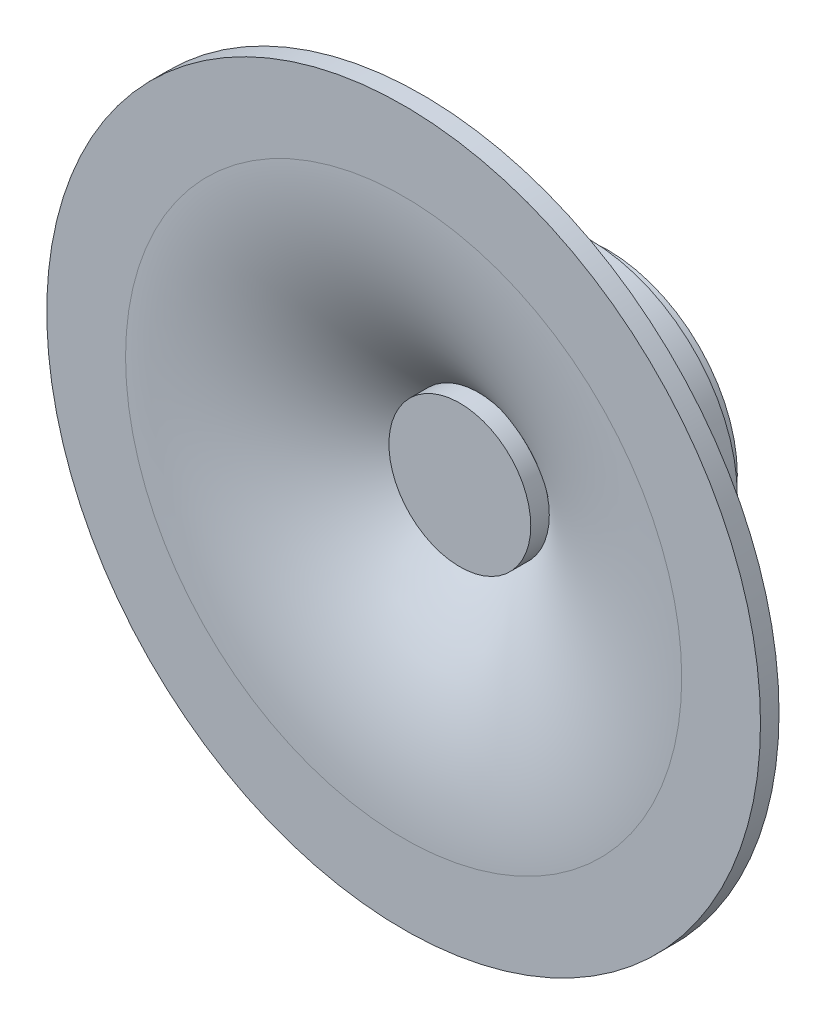
ISO-10303-21;
HEADER;
FILE_DESCRIPTION(('STEP AP214'),'2;1');
FILE_NAME('part.step','',(''),(''),'','','');
FILE_SCHEMA(('AUTOMOTIVE_DESIGN { 1 0 10303 214 1 1 1 1 }'));
ENDSEC;
DATA;
#1=APPLICATION_CONTEXT('core data for automotive mechanical design processes');
#2=APPLICATION_PROTOCOL_DEFINITION('international standard','automotive_design',2000,#1);
#3=PRODUCT_CONTEXT('',#1,'mechanical');
#4=PRODUCT('Part','Part','',(#3));
#5=PRODUCT_RELATED_PRODUCT_CATEGORY('part','',(#4));
#6=PRODUCT_DEFINITION_FORMATION('','',#4);
#7=PRODUCT_DEFINITION_CONTEXT('part definition',#1,'design');
#8=PRODUCT_DEFINITION('design','',#6,#7);
#9=PRODUCT_DEFINITION_SHAPE('','',#8);
#10=(LENGTH_UNIT() NAMED_UNIT(*) SI_UNIT(.MILLI.,.METRE.));
#11=(NAMED_UNIT(*) PLANE_ANGLE_UNIT() SI_UNIT($,.RADIAN.));
#12=(NAMED_UNIT(*) SI_UNIT($,.STERADIAN.) SOLID_ANGLE_UNIT());
#13=UNCERTAINTY_MEASURE_WITH_UNIT(LENGTH_MEASURE(1.E-05),#10,'distance_accuracy_value','');
#14=(GEOMETRIC_REPRESENTATION_CONTEXT(3) GLOBAL_UNCERTAINTY_ASSIGNED_CONTEXT((#13)) GLOBAL_UNIT_ASSIGNED_CONTEXT((#10,
#11,#12)) REPRESENTATION_CONTEXT('',''));
#15=CARTESIAN_POINT('',(0.,0.,0.));
#16=DIRECTION('',(0.,0.,1.));
#17=DIRECTION('',(1.,0.,0.));
#18=AXIS2_PLACEMENT_3D('',#15,#16,#17);
#19=CARTESIAN_POINT('',(0.,0.,-20.));
#20=DIRECTION('',(0.,0.,1.));
#21=DIRECTION('',(1.,0.,0.));
#22=AXIS2_PLACEMENT_3D('',#19,#20,#21);
#23=PLANE('',#22);
#24=CARTESIAN_POINT('',(0.,0.,-20.));
#25=DIRECTION('',(0.,0.,1.));
#26=DIRECTION('',(1.,0.,0.));
#27=AXIS2_PLACEMENT_3D('',#24,#25,#26);
#28=CIRCLE('',#27,14.);
#29=CARTESIAN_POINT('',(14.,0.,-20.));
#30=VERTEX_POINT('',#29);
#31=EDGE_CURVE('E10',#30,#30,#28,.T.);
#32=ORIENTED_EDGE('',*,*,#31,.F.);
#33=EDGE_LOOP('',(#32));
#34=FACE_BOUND('',#33,.T.);
#35=ADVANCED_FACE('F30',(#34),#23,.F.);
#36=CARTESIAN_POINT('',(0.,0.,-4.0653104714385));
#37=DIRECTION('',(0.,0.,1.));
#38=DIRECTION('',(1.,0.,0.));
#39=AXIS2_PLACEMENT_3D('',#36,#37,#38);
#40=CYLINDRICAL_SURFACE('',#39,14.);
#41=CARTESIAN_POINT('',(0.,0.,-18.));
#42=DIRECTION('',(0.,0.,1.));
#43=DIRECTION('',(1.,0.,0.));
#44=AXIS2_PLACEMENT_3D('',#41,#42,#43);
#45=CIRCLE('',#44,14.);
#46=CARTESIAN_POINT('',(14.,0.,-18.));
#47=VERTEX_POINT('',#46);
#48=EDGE_CURVE('E36',#47,#47,#45,.T.);
#49=ORIENTED_EDGE('',*,*,#48,.F.);
#50=EDGE_LOOP('',(#49));
#51=FACE_BOUND('',#50,.T.);
#52=ORIENTED_EDGE('',*,*,#31,.T.);
#53=EDGE_LOOP('',(#52));
#54=FACE_BOUND('',#53,.T.);
#55=ADVANCED_FACE('F141',(#51,#54),#40,.T.);
#56=CARTESIAN_POINT('',(0.,14.,-18.));
#57=DIRECTION('',(0.,0.,1.));
#58=DIRECTION('',(1.,0.,0.));
#59=AXIS2_PLACEMENT_3D('',#56,#57,#58);
#60=PLANE('',#59);
#61=CARTESIAN_POINT('',(0.,0.,-18.));
#62=DIRECTION('',(0.,0.,1.));
#63=DIRECTION('',(1.,0.,0.));
#64=AXIS2_PLACEMENT_3D('',#61,#62,#63);
#65=CIRCLE('',#64,16.);
#66=CARTESIAN_POINT('',(16.,0.,-18.));
#67=VERTEX_POINT('',#66);
#68=EDGE_CURVE('E40',#67,#67,#65,.T.);
#69=ORIENTED_EDGE('',*,*,#68,.F.);
#70=EDGE_LOOP('',(#69));
#71=FACE_BOUND('',#70,.T.);
#72=ORIENTED_EDGE('',*,*,#48,.T.);
#73=EDGE_LOOP('',(#72));
#74=FACE_BOUND('',#73,.T.);
#75=ADVANCED_FACE('F136',(#71,#74),#60,.F.);
#76=CARTESIAN_POINT('',(0.,0.,-4.0653104714385));
#77=DIRECTION('',(0.,0.,1.));
#78=DIRECTION('',(1.,0.,0.));
#79=AXIS2_PLACEMENT_3D('',#76,#77,#78);
#80=CYLINDRICAL_SURFACE('',#79,16.);
#81=CARTESIAN_POINT('',(0.,0.,-12.));
#82=DIRECTION('',(0.,0.,1.));
#83=DIRECTION('',(1.,0.,0.));
#84=AXIS2_PLACEMENT_3D('',#81,#82,#83);
#85=CIRCLE('',#84,16.);
#86=CARTESIAN_POINT('',(16.,0.,-12.));
#87=VERTEX_POINT('',#86);
#88=EDGE_CURVE('E44',#87,#87,#85,.T.);
#89=ORIENTED_EDGE('',*,*,#88,.F.);
#90=EDGE_LOOP('',(#89));
#91=FACE_BOUND('',#90,.T.);
#92=ORIENTED_EDGE('',*,*,#68,.T.);
#93=EDGE_LOOP('',(#92));
#94=FACE_BOUND('',#93,.T.);
#95=ADVANCED_FACE('F130',(#91,#94),#80,.T.);
#96=CARTESIAN_POINT('',(0.,16.,-12.));
#97=DIRECTION('',(0.,0.,-1.));
#98=DIRECTION('',(-1.,0.,0.));
#99=AXIS2_PLACEMENT_3D('',#96,#97,#98);
#100=PLANE('',#99);
#101=CARTESIAN_POINT('',(0.,0.,-12.));
#102=DIRECTION('',(0.,0.,1.));
#103=DIRECTION('',(1.,0.,0.));
#104=AXIS2_PLACEMENT_3D('',#101,#102,#103);
#105=CIRCLE('',#104,14.);
#106=CARTESIAN_POINT('',(14.,0.,-12.));
#107=VERTEX_POINT('',#106);
#108=EDGE_CURVE('E49',#107,#107,#105,.T.);
#109=ORIENTED_EDGE('',*,*,#108,.F.);
#110=EDGE_LOOP('',(#109));
#111=FACE_BOUND('',#110,.T.);
#112=ORIENTED_EDGE('',*,*,#88,.T.);
#113=EDGE_LOOP('',(#112));
#114=FACE_BOUND('',#113,.T.);
#115=ADVANCED_FACE('F124',(#111,#114),#100,.F.);
#116=CARTESIAN_POINT('',(0.,0.,-4.0653104714385));
#117=DIRECTION('',(0.,0.,1.));
#118=DIRECTION('',(1.,0.,0.));
#119=AXIS2_PLACEMENT_3D('',#116,#117,#118);
#120=CYLINDRICAL_SURFACE('',#119,14.);
#121=CARTESIAN_POINT('',(0.,0.,-10.));
#122=DIRECTION('',(0.,0.,1.));
#123=DIRECTION('',(1.,0.,0.));
#124=AXIS2_PLACEMENT_3D('',#121,#122,#123);
#125=CIRCLE('',#124,14.);
#126=CARTESIAN_POINT('',(14.,0.,-10.));
#127=VERTEX_POINT('',#126);
#128=EDGE_CURVE('E52',#127,#127,#125,.T.);
#129=ORIENTED_EDGE('',*,*,#128,.F.);
#130=EDGE_LOOP('',(#129));
#131=FACE_BOUND('',#130,.T.);
#132=ORIENTED_EDGE('',*,*,#108,.T.);
#133=EDGE_LOOP('',(#132));
#134=FACE_BOUND('',#133,.T.);
#135=ADVANCED_FACE('F118',(#131,#134),#120,.T.);
#136=CARTESIAN_POINT('',(0.,0.,-5.5));
#137=DIRECTION('',(0.,0.,1.));
#138=DIRECTION('',(1.,0.,0.));
#139=AXIS2_PLACEMENT_3D('',#136,#137,#138);
#140=TOROIDAL_SURFACE('',#139,14.,4.5);
#141=CARTESIAN_POINT('',(0.,0.,-7.5));
#142=DIRECTION('',(0.,0.,1.));
#143=DIRECTION('',(1.,0.,0.));
#144=AXIS2_PLACEMENT_3D('',#141,#142,#143);
#145=CIRCLE('',#144,18.0311288741493);
#146=CARTESIAN_POINT('',(18.0311288741493,0.,-7.5));
#147=VERTEX_POINT('',#146);
#148=EDGE_CURVE('E55',#147,#147,#145,.T.);
#149=ORIENTED_EDGE('',*,*,#148,.F.);
#150=EDGE_LOOP('',(#149));
#151=FACE_BOUND('',#150,.T.);
#152=ORIENTED_EDGE('',*,*,#128,.T.);
#153=EDGE_LOOP('',(#152));
#154=FACE_BOUND('',#153,.T.);
#155=ADVANCED_FACE('F112',(#151,#154),#140,.T.);
#156=CARTESIAN_POINT('',(0.,0.,-7.5));
#157=DIRECTION('',(0.,0.,1.));
#158=DIRECTION('',(1.,0.,0.));
#159=AXIS2_PLACEMENT_3D('',#156,#157,#158);
#160=CONICAL_SURFACE('',#159,18.0311288741493,1.15462696822804);
#161=CARTESIAN_POINT('',(0.,0.,0.));
#162=DIRECTION('',(0.,0.,1.));
#163=DIRECTION('',(1.,0.,0.));
#164=AXIS2_PLACEMENT_3D('',#161,#162,#163);
#165=CIRCLE('',#164,35.);
#166=CARTESIAN_POINT('',(35.,0.,0.));
#167=VERTEX_POINT('',#166);
#168=EDGE_CURVE('E58',#167,#167,#165,.T.);
#169=ORIENTED_EDGE('',*,*,#168,.F.);
#170=EDGE_LOOP('',(#169));
#171=FACE_BOUND('',#170,.T.);
#172=ORIENTED_EDGE('',*,*,#148,.T.);
#173=EDGE_LOOP('',(#172));
#174=FACE_BOUND('',#173,.T.);
#175=ADVANCED_FACE('F106',(#171,#174),#160,.T.);
#176=CARTESIAN_POINT('',(0.,35.,0.));
#177=DIRECTION('',(0.,0.,1.));
#178=DIRECTION('',(1.,0.,0.));
#179=AXIS2_PLACEMENT_3D('',#176,#177,#178);
#180=PLANE('',#179);
#181=CARTESIAN_POINT('',(0.,0.,0.));
#182=DIRECTION('',(0.,0.,1.));
#183=DIRECTION('',(1.,0.,0.));
#184=AXIS2_PLACEMENT_3D('',#181,#182,#183);
#185=CIRCLE('',#184,38.5);
#186=CARTESIAN_POINT('',(38.5,0.,0.));
#187=VERTEX_POINT('',#186);
#188=EDGE_CURVE('E61',#187,#187,#185,.T.);
#189=ORIENTED_EDGE('',*,*,#188,.F.);
#190=EDGE_LOOP('',(#189));
#191=FACE_BOUND('',#190,.T.);
#192=ORIENTED_EDGE('',*,*,#168,.T.);
#193=EDGE_LOOP('',(#192));
#194=FACE_BOUND('',#193,.T.);
#195=ADVANCED_FACE('F100',(#191,#194),#180,.F.);
#196=CARTESIAN_POINT('',(0.,0.,-4.0653104714385));
#197=DIRECTION('',(0.,0.,1.));
#198=DIRECTION('',(1.,0.,0.));
#199=AXIS2_PLACEMENT_3D('',#196,#197,#198);
#200=CYLINDRICAL_SURFACE('',#199,38.5);
#201=CARTESIAN_POINT('',(0.,0.,2.));
#202=DIRECTION('',(0.,0.,1.));
#203=DIRECTION('',(1.,0.,0.));
#204=AXIS2_PLACEMENT_3D('',#201,#202,#203);
#205=CIRCLE('',#204,38.5);
#206=CARTESIAN_POINT('',(38.5,0.,2.));
#207=VERTEX_POINT('',#206);
#208=EDGE_CURVE('E64',#207,#207,#205,.T.);
#209=ORIENTED_EDGE('',*,*,#208,.F.);
#210=EDGE_LOOP('',(#209));
#211=FACE_BOUND('',#210,.T.);
#212=ORIENTED_EDGE('',*,*,#188,.T.);
#213=EDGE_LOOP('',(#212));
#214=FACE_BOUND('',#213,.T.);
#215=ADVANCED_FACE('F94',(#211,#214),#200,.T.);
#216=CARTESIAN_POINT('',(0.,38.5,2.));
#217=DIRECTION('',(0.,0.,-1.));
#218=DIRECTION('',(-1.,0.,0.));
#219=AXIS2_PLACEMENT_3D('',#216,#217,#218);
#220=PLANE('',#219);
#221=CARTESIAN_POINT('',(0.,0.,2.));
#222=DIRECTION('',(0.,0.,1.));
#223=DIRECTION('',(1.,0.,0.));
#224=AXIS2_PLACEMENT_3D('',#221,#222,#223);
#225=CIRCLE('',#224,30.);
#226=CARTESIAN_POINT('',(30.,0.,2.));
#227=VERTEX_POINT('',#226);
#228=EDGE_CURVE('E67',#227,#227,#225,.T.);
#229=ORIENTED_EDGE('',*,*,#228,.F.);
#230=EDGE_LOOP('',(#229));
#231=FACE_BOUND('',#230,.T.);
#232=ORIENTED_EDGE('',*,*,#208,.T.);
#233=EDGE_LOOP('',(#232));
#234=FACE_BOUND('',#233,.T.);
#235=ADVANCED_FACE('F88',(#231,#234),#220,.F.);
#236=CARTESIAN_POINT('',(0.,0.,-33.));
#237=DIRECTION('',(0.,0.,1.));
#238=DIRECTION('',(1.,0.,0.));
#239=AXIS2_PLACEMENT_3D('',#236,#237,#238);
#240=DEGENERATE_TOROIDAL_SURFACE('',#239,30.,35.,.T.);
#241=CARTESIAN_POINT('',(0.,0.,-6.06531047143849));
#242=DIRECTION('',(0.,0.,1.));
#243=DIRECTION('',(1.,0.,0.));
#244=AXIS2_PLACEMENT_3D('',#241,#242,#243);
#245=CIRCLE('',#244,7.65000000000002);
#246=CARTESIAN_POINT('',(7.65000000000002,0.,-6.06531047143849));
#247=VERTEX_POINT('',#246);
#248=EDGE_CURVE('E70',#247,#247,#245,.T.);
#249=ORIENTED_EDGE('',*,*,#248,.F.);
#250=EDGE_LOOP('',(#249));
#251=FACE_BOUND('',#250,.T.);
#252=ORIENTED_EDGE('',*,*,#228,.T.);
#253=EDGE_LOOP('',(#252));
#254=FACE_BOUND('',#253,.T.);
#255=ADVANCED_FACE('F82',(#251,#254),#240,.T.);
#256=CARTESIAN_POINT('',(0.,0.,-4.0653104714385));
#257=DIRECTION('',(0.,0.,1.));
#258=DIRECTION('',(1.,0.,0.));
#259=AXIS2_PLACEMENT_3D('',#256,#257,#258);
#260=CYLINDRICAL_SURFACE('',#259,7.65000000000001);
#261=CARTESIAN_POINT('',(0.,0.,-4.0653104714385));
#262=DIRECTION('',(0.,0.,1.));
#263=DIRECTION('',(1.,0.,0.));
#264=AXIS2_PLACEMENT_3D('',#261,#262,#263);
#265=CIRCLE('',#264,7.65000000000001);
#266=CARTESIAN_POINT('',(7.65000000000001,0.,-4.0653104714385));
#267=VERTEX_POINT('',#266);
#268=EDGE_CURVE('E73',#267,#267,#265,.T.);
#269=ORIENTED_EDGE('',*,*,#268,.F.);
#270=EDGE_LOOP('',(#269));
#271=FACE_BOUND('',#270,.T.);
#272=ORIENTED_EDGE('',*,*,#248,.T.);
#273=EDGE_LOOP('',(#272));
#274=FACE_BOUND('',#273,.T.);
#275=ADVANCED_FACE('F79',(#271,#274),#260,.T.);
#276=CARTESIAN_POINT('',(0.,7.65000000000001,-4.0653104714385));
#277=DIRECTION('',(0.,0.,-1.));
#278=DIRECTION('',(-1.,0.,0.));
#279=AXIS2_PLACEMENT_3D('',#276,#277,#278);
#280=PLANE('',#279);
#281=ORIENTED_EDGE('',*,*,#268,.T.);
#282=EDGE_LOOP('',(#281));
#283=FACE_BOUND('',#282,.T.);
#284=ADVANCED_FACE('F77',(#283),#280,.F.);
#285=CLOSED_SHELL('',(#35,#55,#75,#95,#115,#135,#155,#175,#195,#215,#235,#255,#275,#284));
#286=MANIFOLD_SOLID_BREP('B2',#285);
#287=ADVANCED_BREP_SHAPE_REPRESENTATION('',(#18,#286),#14);
#288=SHAPE_DEFINITION_REPRESENTATION(#9,#287);
ENDSEC;
END-ISO-10303-21;
